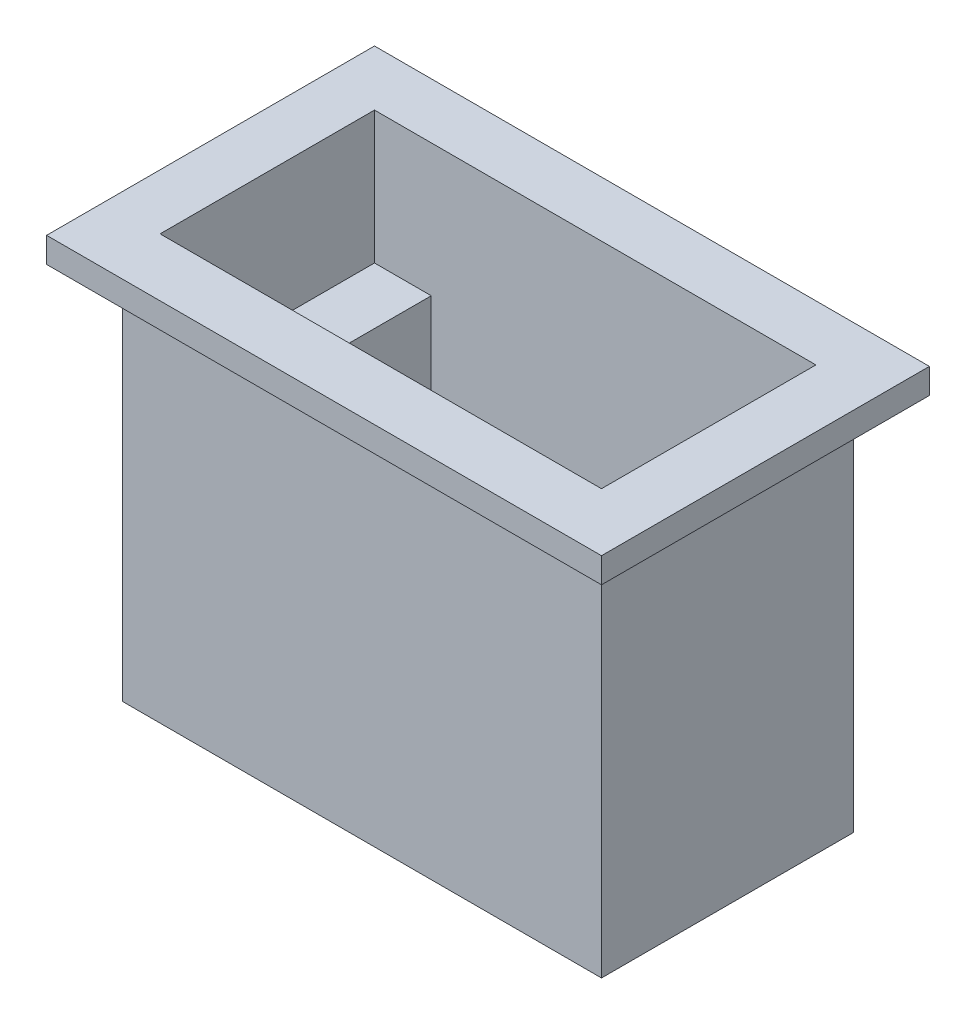
ISO-10303-21;
HEADER;
FILE_DESCRIPTION(('STEP AP214'),'2;1');
FILE_NAME('part.step','',(''),(''),'','','');
FILE_SCHEMA(('AUTOMOTIVE_DESIGN { 1 0 10303 214 1 1 1 1 }'));
ENDSEC;
DATA;
#1=APPLICATION_CONTEXT('core data for automotive mechanical design processes');
#2=APPLICATION_PROTOCOL_DEFINITION('international standard','automotive_design',2000,#1);
#3=PRODUCT_CONTEXT('',#1,'mechanical');
#4=PRODUCT('Part','Part','',(#3));
#5=PRODUCT_RELATED_PRODUCT_CATEGORY('part','',(#4));
#6=PRODUCT_DEFINITION_FORMATION('','',#4);
#7=PRODUCT_DEFINITION_CONTEXT('part definition',#1,'design');
#8=PRODUCT_DEFINITION('design','',#6,#7);
#9=PRODUCT_DEFINITION_SHAPE('','',#8);
#10=(LENGTH_UNIT() NAMED_UNIT(*) SI_UNIT(.MILLI.,.METRE.));
#11=(NAMED_UNIT(*) PLANE_ANGLE_UNIT() SI_UNIT($,.RADIAN.));
#12=(NAMED_UNIT(*) SI_UNIT($,.STERADIAN.) SOLID_ANGLE_UNIT());
#13=UNCERTAINTY_MEASURE_WITH_UNIT(LENGTH_MEASURE(1.E-05),#10,'distance_accuracy_value','');
#14=(GEOMETRIC_REPRESENTATION_CONTEXT(3) GLOBAL_UNCERTAINTY_ASSIGNED_CONTEXT((#13)) GLOBAL_UNIT_ASSIGNED_CONTEXT((#10,
#11,#12)) REPRESENTATION_CONTEXT('',''));
#15=CARTESIAN_POINT('',(0.,0.,0.));
#16=DIRECTION('',(0.,0.,1.));
#17=DIRECTION('',(1.,0.,0.));
#18=AXIS2_PLACEMENT_3D('',#15,#16,#17);
#19=CARTESIAN_POINT('',(-9.00000000000001,4.,-4.54285714285715));
#20=DIRECTION('',(0.,0.,-1.));
#21=DIRECTION('',(-1.,0.,0.));
#22=AXIS2_PLACEMENT_3D('',#19,#20,#21);
#23=PLANE('',#22);
#24=DIRECTION('',(0.,-1.,0.));
#25=VECTOR('',#24,1.);
#26=CARTESIAN_POINT('',(20.,21.5,-4.54285714285715));
#27=LINE('',#26,#25);
#28=CARTESIAN_POINT('',(20.,21.5,-4.54285714285715));
#29=VERTEX_POINT('',#28);
#30=CARTESIAN_POINT('',(20.,4.,-4.54285714285715));
#31=VERTEX_POINT('',#30);
#32=EDGE_CURVE('E232',#29,#31,#27,.T.);
#33=ORIENTED_EDGE('',*,*,#32,.F.);
#34=DIRECTION('',(-1.,0.,0.));
#35=VECTOR('',#34,1.);
#36=CARTESIAN_POINT('',(20.,21.5,-4.54285714285715));
#37=LINE('',#36,#35);
#38=CARTESIAN_POINT('',(26.,21.5,-4.54285714285715));
#39=VERTEX_POINT('',#38);
#40=EDGE_CURVE('E230',#39,#29,#37,.T.);
#41=ORIENTED_EDGE('',*,*,#40,.F.);
#42=DIRECTION('',(0.,1.,0.));
#43=VECTOR('',#42,1.);
#44=CARTESIAN_POINT('',(26.,4.,-4.54285714285715));
#45=LINE('',#44,#43);
#46=CARTESIAN_POINT('',(26.,32.,-4.54285714285715));
#47=VERTEX_POINT('',#46);
#48=EDGE_CURVE('E275',#39,#47,#45,.T.);
#49=ORIENTED_EDGE('',*,*,#48,.T.);
#50=DIRECTION('',(-1.,0.,0.));
#51=VECTOR('',#50,1.);
#52=CARTESIAN_POINT('',(-9.00000000000001,32.,-4.54285714285715));
#53=LINE('',#52,#51);
#54=CARTESIAN_POINT('',(-9.00000000000001,32.,-4.54285714285715));
#55=VERTEX_POINT('',#54);
#56=EDGE_CURVE('E259',#47,#55,#53,.T.);
#57=ORIENTED_EDGE('',*,*,#56,.T.);
#58=DIRECTION('',(0.,1.,0.));
#59=VECTOR('',#58,1.);
#60=CARTESIAN_POINT('',(-9.00000000000001,4.,-4.54285714285715));
#61=LINE('',#60,#59);
#62=CARTESIAN_POINT('',(-9.00000000000001,21.5,-4.54285714285715));
#63=VERTEX_POINT('',#62);
#64=EDGE_CURVE('E272',#63,#55,#61,.T.);
#65=ORIENTED_EDGE('',*,*,#64,.F.);
#66=DIRECTION('',(-1.,0.,0.));
#67=VECTOR('',#66,1.);
#68=CARTESIAN_POINT('',(-9.00000000000001,21.5,-4.54285714285715));
#69=LINE('',#68,#67);
#70=CARTESIAN_POINT('',(-4.5,21.5,-4.54285714285715));
#71=VERTEX_POINT('',#70);
#72=EDGE_CURVE('E245',#71,#63,#69,.T.);
#73=ORIENTED_EDGE('',*,*,#72,.F.);
#74=DIRECTION('',(0.,-1.,0.));
#75=VECTOR('',#74,1.);
#76=CARTESIAN_POINT('',(-4.5,21.5,-4.54285714285715));
#77=LINE('',#76,#75);
#78=CARTESIAN_POINT('',(-4.5,4.,-4.54285714285715));
#79=VERTEX_POINT('',#78);
#80=EDGE_CURVE('E247',#71,#79,#77,.T.);
#81=ORIENTED_EDGE('',*,*,#80,.T.);
#82=DIRECTION('',(-1.,0.,0.));
#83=VECTOR('',#82,1.);
#84=CARTESIAN_POINT('',(-9.00000000000001,4.,-4.54285714285715));
#85=LINE('',#84,#83);
#86=EDGE_CURVE('E258',#31,#79,#85,.T.);
#87=ORIENTED_EDGE('',*,*,#86,.F.);
#88=EDGE_LOOP('',(#33,#41,#49,#57,#65,#73,#81,#87));
#89=FACE_BOUND('',#88,.T.);
#90=ADVANCED_FACE('F57',(#89),#23,.F.);
#91=CARTESIAN_POINT('',(-9.00000000000001,4.,12.4571428571429));
#92=DIRECTION('',(0.,0.,1.));
#93=DIRECTION('',(1.,0.,0.));
#94=AXIS2_PLACEMENT_3D('',#91,#92,#93);
#95=PLANE('',#94);
#96=DIRECTION('',(0.,-1.,0.));
#97=VECTOR('',#96,1.);
#98=CARTESIAN_POINT('',(20.,21.5,12.4571428571429));
#99=LINE('',#98,#97);
#100=CARTESIAN_POINT('',(20.,21.5,12.4571428571429));
#101=VERTEX_POINT('',#100);
#102=CARTESIAN_POINT('',(20.,4.,12.4571428571429));
#103=VERTEX_POINT('',#102);
#104=EDGE_CURVE('E235',#101,#103,#99,.T.);
#105=ORIENTED_EDGE('',*,*,#104,.T.);
#106=DIRECTION('',(1.,0.,0.));
#107=VECTOR('',#106,1.);
#108=CARTESIAN_POINT('',(-9.00000000000001,4.,12.4571428571429));
#109=LINE('',#108,#107);
#110=CARTESIAN_POINT('',(-4.5,4.,12.4571428571429));
#111=VERTEX_POINT('',#110);
#112=EDGE_CURVE('E255',#111,#103,#109,.T.);
#113=ORIENTED_EDGE('',*,*,#112,.F.);
#114=DIRECTION('',(0.,-1.,0.));
#115=VECTOR('',#114,1.);
#116=CARTESIAN_POINT('',(-4.5,21.5,12.4571428571429));
#117=LINE('',#116,#115);
#118=CARTESIAN_POINT('',(-4.5,21.5,12.4571428571429));
#119=VERTEX_POINT('',#118);
#120=EDGE_CURVE('E252',#119,#111,#117,.T.);
#121=ORIENTED_EDGE('',*,*,#120,.F.);
#122=DIRECTION('',(1.,0.,0.));
#123=VECTOR('',#122,1.);
#124=CARTESIAN_POINT('',(-9.,21.5,12.4571428571429));
#125=LINE('',#124,#123);
#126=CARTESIAN_POINT('',(-9.,21.5,12.4571428571429));
#127=VERTEX_POINT('',#126);
#128=EDGE_CURVE('E241',#127,#119,#125,.T.);
#129=ORIENTED_EDGE('',*,*,#128,.F.);
#130=DIRECTION('',(0.,1.,0.));
#131=VECTOR('',#130,1.);
#132=CARTESIAN_POINT('',(-9.00000000000001,4.,12.4571428571429));
#133=LINE('',#132,#131);
#134=CARTESIAN_POINT('',(-9.00000000000001,32.,12.4571428571429));
#135=VERTEX_POINT('',#134);
#136=EDGE_CURVE('E261',#127,#135,#133,.T.);
#137=ORIENTED_EDGE('',*,*,#136,.T.);
#138=DIRECTION('',(1.,0.,0.));
#139=VECTOR('',#138,1.);
#140=CARTESIAN_POINT('',(-9.00000000000001,32.,12.4571428571429));
#141=LINE('',#140,#139);
#142=CARTESIAN_POINT('',(26.,32.,12.4571428571429));
#143=VERTEX_POINT('',#142);
#144=EDGE_CURVE('E264',#135,#143,#141,.T.);
#145=ORIENTED_EDGE('',*,*,#144,.T.);
#146=DIRECTION('',(0.,1.,0.));
#147=VECTOR('',#146,1.);
#148=CARTESIAN_POINT('',(26.,4.,12.4571428571429));
#149=LINE('',#148,#147);
#150=CARTESIAN_POINT('',(26.,21.5,12.4571428571429));
#151=VERTEX_POINT('',#150);
#152=EDGE_CURVE('E277',#151,#143,#149,.T.);
#153=ORIENTED_EDGE('',*,*,#152,.F.);
#154=DIRECTION('',(1.,0.,0.));
#155=VECTOR('',#154,1.);
#156=CARTESIAN_POINT('',(20.,21.5,12.4571428571429));
#157=LINE('',#156,#155);
#158=EDGE_CURVE('E226',#101,#151,#157,.T.);
#159=ORIENTED_EDGE('',*,*,#158,.F.);
#160=EDGE_LOOP('',(#105,#113,#121,#129,#137,#145,#153,#159));
#161=FACE_BOUND('',#160,.T.);
#162=ADVANCED_FACE('F305',(#161),#95,.F.);
#163=CARTESIAN_POINT('',(0.,4.,0.));
#164=DIRECTION('',(0.,1.,0.));
#165=DIRECTION('',(0.,0.,1.));
#166=AXIS2_PLACEMENT_3D('',#163,#164,#165);
#167=PLANE('',#166);
#168=ORIENTED_EDGE('',*,*,#112,.T.);
#169=DIRECTION('',(0.,0.,1.));
#170=VECTOR('',#169,1.);
#171=CARTESIAN_POINT('',(20.,4.,-4.54285714285715));
#172=LINE('',#171,#170);
#173=EDGE_CURVE('E218',#31,#103,#172,.T.);
#174=ORIENTED_EDGE('',*,*,#173,.F.);
#175=ORIENTED_EDGE('',*,*,#86,.T.);
#176=DIRECTION('',(0.,0.,-1.));
#177=VECTOR('',#176,1.);
#178=CARTESIAN_POINT('',(-4.5,4.,-4.54285714285715));
#179=LINE('',#178,#177);
#180=EDGE_CURVE('E238',#111,#79,#179,.T.);
#181=ORIENTED_EDGE('',*,*,#180,.F.);
#182=EDGE_LOOP('',(#168,#174,#175,#181));
#183=FACE_BOUND('',#182,.T.);
#184=ADVANCED_FACE('F311',(#183),#167,.T.);
#185=CARTESIAN_POINT('',(0.,32.,0.));
#186=DIRECTION('',(0.,1.,0.));
#187=DIRECTION('',(0.,0.,1.));
#188=AXIS2_PLACEMENT_3D('',#185,#186,#187);
#189=PLANE('',#188);
#190=DIRECTION('',(0.,0.,1.));
#191=VECTOR('',#190,1.);
#192=CARTESIAN_POINT('',(-9.00000000000001,32.,-4.54285714285715));
#193=LINE('',#192,#191);
#194=EDGE_CURVE('E254',#55,#135,#193,.T.);
#195=ORIENTED_EDGE('',*,*,#194,.F.);
#196=ORIENTED_EDGE('',*,*,#56,.F.);
#197=DIRECTION('',(0.,0.,-1.));
#198=VECTOR('',#197,1.);
#199=CARTESIAN_POINT('',(26.,32.,-4.54285714285715));
#200=LINE('',#199,#198);
#201=EDGE_CURVE('E267',#143,#47,#200,.T.);
#202=ORIENTED_EDGE('',*,*,#201,.F.);
#203=ORIENTED_EDGE('',*,*,#144,.F.);
#204=EDGE_LOOP('',(#195,#196,#202,#203));
#205=FACE_BOUND('',#204,.T.);
#206=DIRECTION('',(0.,0.,1.));
#207=VECTOR('',#206,1.);
#208=CARTESIAN_POINT('',(-13.4,32.,-5.94285714285714));
#209=LINE('',#208,#207);
#210=CARTESIAN_POINT('',(-13.4,32.,-8.94285714285714));
#211=VERTEX_POINT('',#210);
#212=CARTESIAN_POINT('',(-13.4,32.,17.0571428571429));
#213=VERTEX_POINT('',#212);
#214=EDGE_CURVE('E187',#211,#213,#209,.T.);
#215=ORIENTED_EDGE('',*,*,#214,.T.);
#216=DIRECTION('',(1.,0.,0.));
#217=VECTOR('',#216,1.);
#218=CARTESIAN_POINT('',(-10.4,32.,17.0571428571429));
#219=LINE('',#218,#217);
#220=CARTESIAN_POINT('',(30.6,32.,17.0571428571429));
#221=VERTEX_POINT('',#220);
#222=EDGE_CURVE('E190',#213,#221,#219,.T.);
#223=ORIENTED_EDGE('',*,*,#222,.T.);
#224=DIRECTION('',(0.,0.,-1.));
#225=VECTOR('',#224,1.);
#226=CARTESIAN_POINT('',(30.6,32.,-5.94285714285715));
#227=LINE('',#226,#225);
#228=CARTESIAN_POINT('',(30.6,32.,-8.94285714285714));
#229=VERTEX_POINT('',#228);
#230=EDGE_CURVE('E211',#221,#229,#227,.T.);
#231=ORIENTED_EDGE('',*,*,#230,.T.);
#232=DIRECTION('',(-1.,0.,0.));
#233=VECTOR('',#232,1.);
#234=CARTESIAN_POINT('',(-10.4,32.,-8.94285714285714));
#235=LINE('',#234,#233);
#236=EDGE_CURVE('E199',#229,#211,#235,.T.);
#237=ORIENTED_EDGE('',*,*,#236,.T.);
#238=EDGE_LOOP('',(#215,#223,#231,#237));
#239=FACE_BOUND('',#238,.T.);
#240=ADVANCED_FACE('F325',(#205,#239),#189,.T.);
#241=CARTESIAN_POINT('',(-9.00000000000001,4.,-4.54285714285715));
#242=DIRECTION('',(-1.,0.,0.));
#243=DIRECTION('',(0.,0.,1.));
#244=AXIS2_PLACEMENT_3D('',#241,#242,#243);
#245=PLANE('',#244);
#246=ORIENTED_EDGE('',*,*,#136,.F.);
#247=DIRECTION('',(0.,0.,1.));
#248=VECTOR('',#247,1.);
#249=CARTESIAN_POINT('',(-9.00000000000001,21.5,-4.54285714285715));
#250=LINE('',#249,#248);
#251=EDGE_CURVE('E239',#63,#127,#250,.T.);
#252=ORIENTED_EDGE('',*,*,#251,.F.);
#253=ORIENTED_EDGE('',*,*,#64,.T.);
#254=ORIENTED_EDGE('',*,*,#194,.T.);
#255=EDGE_LOOP('',(#246,#252,#253,#254));
#256=FACE_BOUND('',#255,.T.);
#257=ADVANCED_FACE('F321',(#256),#245,.F.);
#258=CARTESIAN_POINT('',(26.,4.,-4.54285714285715));
#259=DIRECTION('',(1.,0.,0.));
#260=DIRECTION('',(0.,0.,-1.));
#261=AXIS2_PLACEMENT_3D('',#258,#259,#260);
#262=PLANE('',#261);
#263=ORIENTED_EDGE('',*,*,#48,.F.);
#264=DIRECTION('',(0.,0.,-1.));
#265=VECTOR('',#264,1.);
#266=CARTESIAN_POINT('',(26.,21.5,-4.54285714285715));
#267=LINE('',#266,#265);
#268=EDGE_CURVE('E228',#151,#39,#267,.T.);
#269=ORIENTED_EDGE('',*,*,#268,.F.);
#270=ORIENTED_EDGE('',*,*,#152,.T.);
#271=ORIENTED_EDGE('',*,*,#201,.T.);
#272=EDGE_LOOP('',(#263,#269,#270,#271));
#273=FACE_BOUND('',#272,.T.);
#274=ADVANCED_FACE('F318',(#273),#262,.F.);
#275=CARTESIAN_POINT('',(-4.5,21.5,-4.54285714285715));
#276=DIRECTION('',(-1.,0.,0.));
#277=DIRECTION('',(0.,0.,1.));
#278=AXIS2_PLACEMENT_3D('',#275,#276,#277);
#279=PLANE('',#278);
#280=ORIENTED_EDGE('',*,*,#180,.T.);
#281=ORIENTED_EDGE('',*,*,#80,.F.);
#282=DIRECTION('',(0.,0.,-1.));
#283=VECTOR('',#282,1.);
#284=CARTESIAN_POINT('',(-4.5,21.5,-4.54285714285715));
#285=LINE('',#284,#283);
#286=EDGE_CURVE('E243',#119,#71,#285,.T.);
#287=ORIENTED_EDGE('',*,*,#286,.F.);
#288=ORIENTED_EDGE('',*,*,#120,.T.);
#289=EDGE_LOOP('',(#280,#281,#287,#288));
#290=FACE_BOUND('',#289,.T.);
#291=ADVANCED_FACE('F320',(#290),#279,.F.);
#292=CARTESIAN_POINT('',(0.,21.5,0.));
#293=DIRECTION('',(0.,1.,0.));
#294=DIRECTION('',(0.,0.,1.));
#295=AXIS2_PLACEMENT_3D('',#292,#293,#294);
#296=PLANE('',#295);
#297=ORIENTED_EDGE('',*,*,#251,.T.);
#298=ORIENTED_EDGE('',*,*,#128,.T.);
#299=ORIENTED_EDGE('',*,*,#286,.T.);
#300=ORIENTED_EDGE('',*,*,#72,.T.);
#301=EDGE_LOOP('',(#297,#298,#299,#300));
#302=FACE_BOUND('',#301,.T.);
#303=ADVANCED_FACE('F370',(#302),#296,.T.);
#304=CARTESIAN_POINT('',(20.,21.5,-4.54285714285715));
#305=DIRECTION('',(1.,0.,0.));
#306=DIRECTION('',(0.,0.,-1.));
#307=AXIS2_PLACEMENT_3D('',#304,#305,#306);
#308=PLANE('',#307);
#309=ORIENTED_EDGE('',*,*,#173,.T.);
#310=ORIENTED_EDGE('',*,*,#104,.F.);
#311=DIRECTION('',(0.,0.,1.));
#312=VECTOR('',#311,1.);
#313=CARTESIAN_POINT('',(20.,21.5,-4.54285714285715));
#314=LINE('',#313,#312);
#315=EDGE_CURVE('E224',#29,#101,#314,.T.);
#316=ORIENTED_EDGE('',*,*,#315,.F.);
#317=ORIENTED_EDGE('',*,*,#32,.T.);
#318=EDGE_LOOP('',(#309,#310,#316,#317));
#319=FACE_BOUND('',#318,.T.);
#320=ADVANCED_FACE('F366',(#319),#308,.F.);
#321=CARTESIAN_POINT('',(0.,21.5,0.));
#322=DIRECTION('',(0.,1.,0.));
#323=DIRECTION('',(0.,0.,1.));
#324=AXIS2_PLACEMENT_3D('',#321,#322,#323);
#325=PLANE('',#324);
#326=ORIENTED_EDGE('',*,*,#315,.T.);
#327=ORIENTED_EDGE('',*,*,#158,.T.);
#328=ORIENTED_EDGE('',*,*,#268,.T.);
#329=ORIENTED_EDGE('',*,*,#40,.T.);
#330=EDGE_LOOP('',(#326,#327,#328,#329));
#331=FACE_BOUND('',#330,.T.);
#332=ADVANCED_FACE('F359',(#331),#325,.T.);
#333=CARTESIAN_POINT('',(-13.4,30.,-5.94285714285714));
#334=DIRECTION('',(-1.,0.,0.));
#335=DIRECTION('',(0.,0.,1.));
#336=AXIS2_PLACEMENT_3D('',#333,#334,#335);
#337=PLANE('',#336);
#338=ORIENTED_EDGE('',*,*,#214,.F.);
#339=DIRECTION('',(0.,1.,0.));
#340=VECTOR('',#339,1.);
#341=CARTESIAN_POINT('',(-13.4,30.,-8.94285714285714));
#342=LINE('',#341,#340);
#343=CARTESIAN_POINT('',(-13.4,30.,-8.94285714285714));
#344=VERTEX_POINT('',#343);
#345=EDGE_CURVE('E216',#344,#211,#342,.T.);
#346=ORIENTED_EDGE('',*,*,#345,.F.);
#347=DIRECTION('',(0.,0.,1.));
#348=VECTOR('',#347,1.);
#349=CARTESIAN_POINT('',(-13.4,30.,-5.94285714285714));
#350=LINE('',#349,#348);
#351=CARTESIAN_POINT('',(-13.4,30.,17.0571428571429));
#352=VERTEX_POINT('',#351);
#353=EDGE_CURVE('E195',#344,#352,#350,.T.);
#354=ORIENTED_EDGE('',*,*,#353,.T.);
#355=DIRECTION('',(0.,1.,0.));
#356=VECTOR('',#355,1.);
#357=CARTESIAN_POINT('',(-13.4,30.,17.0571428571429));
#358=LINE('',#357,#356);
#359=EDGE_CURVE('E207',#352,#213,#358,.T.);
#360=ORIENTED_EDGE('',*,*,#359,.T.);
#361=EDGE_LOOP('',(#338,#346,#354,#360));
#362=FACE_BOUND('',#361,.T.);
#363=ADVANCED_FACE('F341',(#362),#337,.T.);
#364=CARTESIAN_POINT('',(-10.4,30.,-8.94285714285714));
#365=DIRECTION('',(0.,0.,-1.));
#366=DIRECTION('',(-1.,0.,0.));
#367=AXIS2_PLACEMENT_3D('',#364,#365,#366);
#368=PLANE('',#367);
#369=ORIENTED_EDGE('',*,*,#236,.F.);
#370=DIRECTION('',(0.,1.,0.));
#371=VECTOR('',#370,1.);
#372=CARTESIAN_POINT('',(30.6,30.,-8.94285714285714));
#373=LINE('',#372,#371);
#374=CARTESIAN_POINT('',(30.6,30.,-8.94285714285714));
#375=VERTEX_POINT('',#374);
#376=EDGE_CURVE('E219',#375,#229,#373,.T.);
#377=ORIENTED_EDGE('',*,*,#376,.F.);
#378=DIRECTION('',(-1.,0.,0.));
#379=VECTOR('',#378,1.);
#380=CARTESIAN_POINT('',(-10.4,30.,-8.94285714285714));
#381=LINE('',#380,#379);
#382=EDGE_CURVE('E205',#375,#344,#381,.T.);
#383=ORIENTED_EDGE('',*,*,#382,.T.);
#384=ORIENTED_EDGE('',*,*,#345,.T.);
#385=EDGE_LOOP('',(#369,#377,#383,#384));
#386=FACE_BOUND('',#385,.T.);
#387=ADVANCED_FACE('F350',(#386),#368,.T.);
#388=CARTESIAN_POINT('',(30.6,30.,-5.94285714285715));
#389=DIRECTION('',(1.,0.,0.));
#390=DIRECTION('',(0.,0.,-1.));
#391=AXIS2_PLACEMENT_3D('',#388,#389,#390);
#392=PLANE('',#391);
#393=ORIENTED_EDGE('',*,*,#230,.F.);
#394=DIRECTION('',(0.,1.,0.));
#395=VECTOR('',#394,1.);
#396=CARTESIAN_POINT('',(30.6,30.,17.0571428571429));
#397=LINE('',#396,#395);
#398=CARTESIAN_POINT('',(30.6,30.,17.0571428571429));
#399=VERTEX_POINT('',#398);
#400=EDGE_CURVE('E221',#399,#221,#397,.T.);
#401=ORIENTED_EDGE('',*,*,#400,.F.);
#402=DIRECTION('',(0.,0.,-1.));
#403=VECTOR('',#402,1.);
#404=CARTESIAN_POINT('',(30.6,30.,-5.94285714285715));
#405=LINE('',#404,#403);
#406=EDGE_CURVE('E202',#399,#375,#405,.T.);
#407=ORIENTED_EDGE('',*,*,#406,.T.);
#408=ORIENTED_EDGE('',*,*,#376,.T.);
#409=EDGE_LOOP('',(#393,#401,#407,#408));
#410=FACE_BOUND('',#409,.T.);
#411=ADVANCED_FACE('F348',(#410),#392,.T.);
#412=CARTESIAN_POINT('',(-10.4,30.,17.0571428571429));
#413=DIRECTION('',(0.,0.,1.));
#414=DIRECTION('',(1.,0.,0.));
#415=AXIS2_PLACEMENT_3D('',#412,#413,#414);
#416=PLANE('',#415);
#417=ORIENTED_EDGE('',*,*,#222,.F.);
#418=ORIENTED_EDGE('',*,*,#359,.F.);
#419=DIRECTION('',(1.,0.,0.));
#420=VECTOR('',#419,1.);
#421=CARTESIAN_POINT('',(-10.4,30.,17.0571428571429));
#422=LINE('',#421,#420);
#423=EDGE_CURVE('E198',#352,#399,#422,.T.);
#424=ORIENTED_EDGE('',*,*,#423,.T.);
#425=ORIENTED_EDGE('',*,*,#400,.T.);
#426=EDGE_LOOP('',(#417,#418,#424,#425));
#427=FACE_BOUND('',#426,.T.);
#428=ADVANCED_FACE('F301',(#427),#416,.T.);
#429=CARTESIAN_POINT('',(0.,30.,0.));
#430=DIRECTION('',(0.,1.,0.));
#431=DIRECTION('',(0.,0.,1.));
#432=AXIS2_PLACEMENT_3D('',#429,#430,#431);
#433=PLANE('',#432);
#434=DIRECTION('',(-1.,0.,0.));
#435=VECTOR('',#434,1.);
#436=CARTESIAN_POINT('',(-10.4,30.,-5.94285714285715));
#437=LINE('',#436,#435);
#438=CARTESIAN_POINT('',(27.6,30.,-5.94285714285715));
#439=VERTEX_POINT('',#438);
#440=CARTESIAN_POINT('',(-10.4,30.,-5.94285714285715));
#441=VERTEX_POINT('',#440);
#442=EDGE_CURVE('E173',#439,#441,#437,.T.);
#443=ORIENTED_EDGE('',*,*,#442,.T.);
#444=DIRECTION('',(0.,0.,1.));
#445=VECTOR('',#444,1.);
#446=CARTESIAN_POINT('',(-10.4,30.,-5.94285714285715));
#447=LINE('',#446,#445);
#448=CARTESIAN_POINT('',(-10.4,30.,14.0571428571429));
#449=VERTEX_POINT('',#448);
#450=EDGE_CURVE('E182',#441,#449,#447,.T.);
#451=ORIENTED_EDGE('',*,*,#450,.T.);
#452=DIRECTION('',(1.,0.,0.));
#453=VECTOR('',#452,1.);
#454=CARTESIAN_POINT('',(-10.4,30.,14.0571428571429));
#455=LINE('',#454,#453);
#456=CARTESIAN_POINT('',(27.6,30.,14.0571428571429));
#457=VERTEX_POINT('',#456);
#458=EDGE_CURVE('E71',#449,#457,#455,.T.);
#459=ORIENTED_EDGE('',*,*,#458,.T.);
#460=DIRECTION('',(0.,0.,-1.));
#461=VECTOR('',#460,1.);
#462=CARTESIAN_POINT('',(27.6,30.,-5.94285714285715));
#463=LINE('',#462,#461);
#464=EDGE_CURVE('E79',#457,#439,#463,.T.);
#465=ORIENTED_EDGE('',*,*,#464,.T.);
#466=EDGE_LOOP('',(#443,#451,#459,#465));
#467=FACE_BOUND('',#466,.T.);
#468=ORIENTED_EDGE('',*,*,#353,.F.);
#469=ORIENTED_EDGE('',*,*,#382,.F.);
#470=ORIENTED_EDGE('',*,*,#406,.F.);
#471=ORIENTED_EDGE('',*,*,#423,.F.);
#472=EDGE_LOOP('',(#468,#469,#470,#471));
#473=FACE_BOUND('',#472,.T.);
#474=ADVANCED_FACE('F185',(#467,#473),#433,.F.);
#475=CARTESIAN_POINT('',(0.,0.,0.));
#476=DIRECTION('',(0.,1.,0.));
#477=DIRECTION('',(0.,0.,1.));
#478=AXIS2_PLACEMENT_3D('',#475,#476,#477);
#479=PLANE('',#478);
#480=DIRECTION('',(0.,0.,1.));
#481=VECTOR('',#480,1.);
#482=CARTESIAN_POINT('',(-10.4,0.,-5.94285714285715));
#483=LINE('',#482,#481);
#484=CARTESIAN_POINT('',(-10.4,0.,-5.94285714285715));
#485=VERTEX_POINT('',#484);
#486=CARTESIAN_POINT('',(-10.4,0.,14.0571428571429));
#487=VERTEX_POINT('',#486);
#488=EDGE_CURVE('E274',#485,#487,#483,.T.);
#489=ORIENTED_EDGE('',*,*,#488,.F.);
#490=DIRECTION('',(-1.,0.,0.));
#491=VECTOR('',#490,1.);
#492=CARTESIAN_POINT('',(-10.4,0.,-5.94285714285715));
#493=LINE('',#492,#491);
#494=CARTESIAN_POINT('',(27.6,0.,-5.94285714285715));
#495=VERTEX_POINT('',#494);
#496=EDGE_CURVE('E175',#495,#485,#493,.T.);
#497=ORIENTED_EDGE('',*,*,#496,.F.);
#498=DIRECTION('',(0.,0.,-1.));
#499=VECTOR('',#498,1.);
#500=CARTESIAN_POINT('',(27.6,0.,-5.94285714285715));
#501=LINE('',#500,#499);
#502=CARTESIAN_POINT('',(27.6,0.,14.0571428571429));
#503=VERTEX_POINT('',#502);
#504=EDGE_CURVE('E284',#503,#495,#501,.T.);
#505=ORIENTED_EDGE('',*,*,#504,.F.);
#506=DIRECTION('',(1.,0.,0.));
#507=VECTOR('',#506,1.);
#508=CARTESIAN_POINT('',(-10.4,0.,14.0571428571429));
#509=LINE('',#508,#507);
#510=EDGE_CURVE('E281',#487,#503,#509,.T.);
#511=ORIENTED_EDGE('',*,*,#510,.F.);
#512=EDGE_LOOP('',(#489,#497,#505,#511));
#513=FACE_BOUND('',#512,.T.);
#514=ADVANCED_FACE('F293',(#513),#479,.F.);
#515=CARTESIAN_POINT('',(-10.4,32.,-5.94285714285715));
#516=DIRECTION('',(0.,0.,1.));
#517=DIRECTION('',(1.,0.,0.));
#518=AXIS2_PLACEMENT_3D('',#515,#516,#517);
#519=PLANE('',#518);
#520=ORIENTED_EDGE('',*,*,#442,.F.);
#521=DIRECTION('',(0.,-1.,0.));
#522=VECTOR('',#521,1.);
#523=CARTESIAN_POINT('',(27.6,32.,-5.94285714285715));
#524=LINE('',#523,#522);
#525=EDGE_CURVE('E179',#439,#495,#524,.T.);
#526=ORIENTED_EDGE('',*,*,#525,.T.);
#527=ORIENTED_EDGE('',*,*,#496,.T.);
#528=DIRECTION('',(0.,-1.,0.));
#529=VECTOR('',#528,1.);
#530=CARTESIAN_POINT('',(-10.4,32.,-5.94285714285715));
#531=LINE('',#530,#529);
#532=EDGE_CURVE('E169',#441,#485,#531,.T.);
#533=ORIENTED_EDGE('',*,*,#532,.F.);
#534=EDGE_LOOP('',(#520,#526,#527,#533));
#535=FACE_BOUND('',#534,.T.);
#536=ADVANCED_FACE('F171',(#535),#519,.F.);
#537=CARTESIAN_POINT('',(27.6,32.,-5.94285714285715));
#538=DIRECTION('',(-1.,0.,0.));
#539=DIRECTION('',(0.,0.,1.));
#540=AXIS2_PLACEMENT_3D('',#537,#538,#539);
#541=PLANE('',#540);
#542=ORIENTED_EDGE('',*,*,#464,.F.);
#543=DIRECTION('',(0.,-1.,0.));
#544=VECTOR('',#543,1.);
#545=CARTESIAN_POINT('',(27.6,32.,14.0571428571429));
#546=LINE('',#545,#544);
#547=EDGE_CURVE('E65',#457,#503,#546,.T.);
#548=ORIENTED_EDGE('',*,*,#547,.T.);
#549=ORIENTED_EDGE('',*,*,#504,.T.);
#550=ORIENTED_EDGE('',*,*,#525,.F.);
#551=EDGE_LOOP('',(#542,#548,#549,#550));
#552=FACE_BOUND('',#551,.T.);
#553=ADVANCED_FACE('F288',(#552),#541,.F.);
#554=CARTESIAN_POINT('',(-10.4,32.,14.0571428571429));
#555=DIRECTION('',(0.,0.,-1.));
#556=DIRECTION('',(-1.,0.,0.));
#557=AXIS2_PLACEMENT_3D('',#554,#555,#556);
#558=PLANE('',#557);
#559=ORIENTED_EDGE('',*,*,#458,.F.);
#560=DIRECTION('',(0.,-1.,0.));
#561=VECTOR('',#560,1.);
#562=CARTESIAN_POINT('',(-10.4,32.,14.0571428571429));
#563=LINE('',#562,#561);
#564=EDGE_CURVE('E12',#449,#487,#563,.T.);
#565=ORIENTED_EDGE('',*,*,#564,.T.);
#566=ORIENTED_EDGE('',*,*,#510,.T.);
#567=ORIENTED_EDGE('',*,*,#547,.F.);
#568=EDGE_LOOP('',(#559,#565,#566,#567));
#569=FACE_BOUND('',#568,.T.);
#570=ADVANCED_FACE('F291',(#569),#558,.F.);
#571=CARTESIAN_POINT('',(-10.4,32.,-5.94285714285715));
#572=DIRECTION('',(1.,0.,0.));
#573=DIRECTION('',(0.,0.,-1.));
#574=AXIS2_PLACEMENT_3D('',#571,#572,#573);
#575=PLANE('',#574);
#576=ORIENTED_EDGE('',*,*,#450,.F.);
#577=ORIENTED_EDGE('',*,*,#532,.T.);
#578=ORIENTED_EDGE('',*,*,#488,.T.);
#579=ORIENTED_EDGE('',*,*,#564,.F.);
#580=EDGE_LOOP('',(#576,#577,#578,#579));
#581=FACE_BOUND('',#580,.T.);
#582=ADVANCED_FACE('F59',(#581),#575,.F.);
#583=CLOSED_SHELL('',(#90,#162,#184,#240,#257,#274,#291,#303,#320,#332,#363,#387,#411,#428,#474,
#514,#536,#553,#570,#582));
#584=MANIFOLD_SOLID_BREP('B2',#583);
#585=ADVANCED_BREP_SHAPE_REPRESENTATION('',(#18,#584),#14);
#586=SHAPE_DEFINITION_REPRESENTATION(#9,#585);
ENDSEC;
END-ISO-10303-21;
